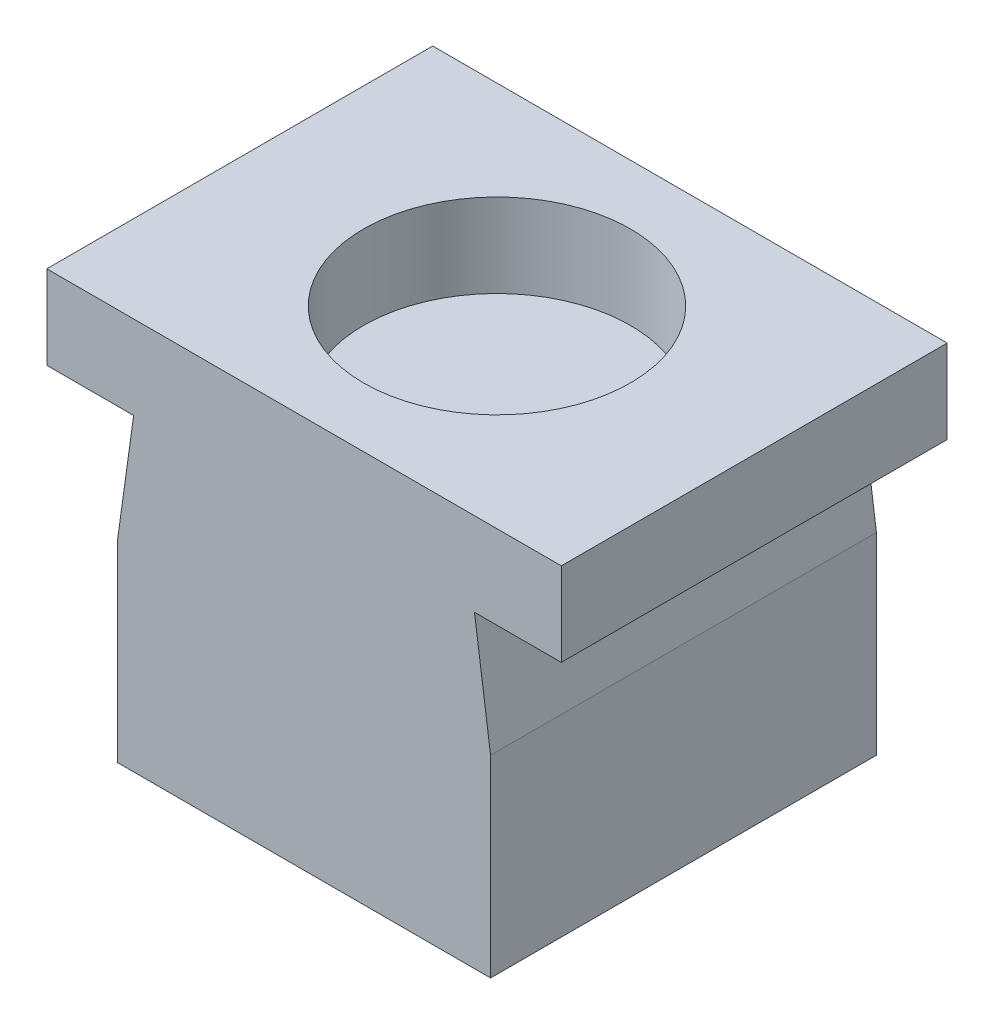
ISO-10303-21;
HEADER;
FILE_DESCRIPTION(('STEP AP214'),'2;1');
FILE_NAME('part.step','',(''),(''),'','','');
FILE_SCHEMA(('AUTOMOTIVE_DESIGN { 1 0 10303 214 1 1 1 1 }'));
ENDSEC;
DATA;
#1=APPLICATION_CONTEXT('core data for automotive mechanical design processes');
#2=APPLICATION_PROTOCOL_DEFINITION('international standard','automotive_design',2000,#1);
#3=PRODUCT_CONTEXT('',#1,'mechanical');
#4=PRODUCT('Part','Part','',(#3));
#5=PRODUCT_RELATED_PRODUCT_CATEGORY('part','',(#4));
#6=PRODUCT_DEFINITION_FORMATION('','',#4);
#7=PRODUCT_DEFINITION_CONTEXT('part definition',#1,'design');
#8=PRODUCT_DEFINITION('design','',#6,#7);
#9=PRODUCT_DEFINITION_SHAPE('','',#8);
#10=(LENGTH_UNIT() NAMED_UNIT(*) SI_UNIT(.MILLI.,.METRE.));
#11=(NAMED_UNIT(*) PLANE_ANGLE_UNIT() SI_UNIT($,.RADIAN.));
#12=(NAMED_UNIT(*) SI_UNIT($,.STERADIAN.) SOLID_ANGLE_UNIT());
#13=UNCERTAINTY_MEASURE_WITH_UNIT(LENGTH_MEASURE(1.E-05),#10,'distance_accuracy_value','');
#14=(GEOMETRIC_REPRESENTATION_CONTEXT(3) GLOBAL_UNCERTAINTY_ASSIGNED_CONTEXT((#13)) GLOBAL_UNIT_ASSIGNED_CONTEXT((#10,
#11,#12)) REPRESENTATION_CONTEXT('',''));
#15=CARTESIAN_POINT('',(0.,0.,0.));
#16=DIRECTION('',(0.,0.,1.));
#17=DIRECTION('',(1.,0.,0.));
#18=AXIS2_PLACEMENT_3D('',#15,#16,#17);
#19=CARTESIAN_POINT('',(20.,6.5,-15.));
#20=DIRECTION('',(0.,1.,0.));
#21=DIRECTION('',(0.,0.,1.));
#22=AXIS2_PLACEMENT_3D('',#19,#20,#21);
#23=PLANE('',#22);
#24=CARTESIAN_POINT('',(0.,6.5,0.));
#25=DIRECTION('',(0.,1.,0.));
#26=DIRECTION('',(0.,0.,1.));
#27=AXIS2_PLACEMENT_3D('',#24,#25,#26);
#28=CIRCLE('',#27,10.375);
#29=CARTESIAN_POINT('',(0.,6.5,10.375));
#30=VERTEX_POINT('',#29);
#31=EDGE_CURVE('E131',#30,#30,#28,.T.);
#32=ORIENTED_EDGE('',*,*,#31,.F.);
#33=EDGE_LOOP('',(#32));
#34=FACE_BOUND('',#33,.T.);
#35=DIRECTION('',(0.,0.,1.));
#36=VECTOR('',#35,1.);
#37=CARTESIAN_POINT('',(-20.,6.5,-15.));
#38=LINE('',#37,#36);
#39=CARTESIAN_POINT('',(-20.,6.5,-15.));
#40=VERTEX_POINT('',#39);
#41=CARTESIAN_POINT('',(-20.,6.5,15.));
#42=VERTEX_POINT('',#41);
#43=EDGE_CURVE('E36',#40,#42,#38,.T.);
#44=ORIENTED_EDGE('',*,*,#43,.T.);
#45=DIRECTION('',(-1.,0.,0.));
#46=VECTOR('',#45,1.);
#47=CARTESIAN_POINT('',(20.,6.5,15.));
#48=LINE('',#47,#46);
#49=CARTESIAN_POINT('',(20.,6.5,15.));
#50=VERTEX_POINT('',#49);
#51=EDGE_CURVE('E109',#50,#42,#48,.T.);
#52=ORIENTED_EDGE('',*,*,#51,.F.);
#53=DIRECTION('',(0.,0.,1.));
#54=VECTOR('',#53,1.);
#55=CARTESIAN_POINT('',(20.,6.5,-15.));
#56=LINE('',#55,#54);
#57=CARTESIAN_POINT('',(20.,6.5,-15.));
#58=VERTEX_POINT('',#57);
#59=EDGE_CURVE('E11',#58,#50,#56,.T.);
#60=ORIENTED_EDGE('',*,*,#59,.F.);
#61=DIRECTION('',(-1.,0.,0.));
#62=VECTOR('',#61,1.);
#63=CARTESIAN_POINT('',(20.,6.5,-15.));
#64=LINE('',#63,#62);
#65=EDGE_CURVE('E110',#58,#40,#64,.T.);
#66=ORIENTED_EDGE('',*,*,#65,.T.);
#67=EDGE_LOOP('',(#44,#52,#60,#66));
#68=FACE_BOUND('',#67,.T.);
#69=ADVANCED_FACE('F33',(#34,#68),#23,.T.);
#70=CARTESIAN_POINT('',(20.,6.5,-15.));
#71=DIRECTION('',(1.,0.,0.));
#72=DIRECTION('',(0.,0.,-1.));
#73=AXIS2_PLACEMENT_3D('',#70,#71,#72);
#74=PLANE('',#73);
#75=ORIENTED_EDGE('',*,*,#59,.T.);
#76=DIRECTION('',(0.,1.,0.));
#77=VECTOR('',#76,1.);
#78=CARTESIAN_POINT('',(20.,6.5,15.));
#79=LINE('',#78,#77);
#80=CARTESIAN_POINT('',(20.,0.,15.));
#81=VERTEX_POINT('',#80);
#82=EDGE_CURVE('E127',#81,#50,#79,.T.);
#83=ORIENTED_EDGE('',*,*,#82,.F.);
#84=DIRECTION('',(0.,0.,1.));
#85=VECTOR('',#84,1.);
#86=CARTESIAN_POINT('',(20.,0.,-15.));
#87=LINE('',#86,#85);
#88=CARTESIAN_POINT('',(20.,0.,-15.));
#89=VERTEX_POINT('',#88);
#90=EDGE_CURVE('E41',#89,#81,#87,.T.);
#91=ORIENTED_EDGE('',*,*,#90,.F.);
#92=DIRECTION('',(0.,1.,0.));
#93=VECTOR('',#92,1.);
#94=CARTESIAN_POINT('',(20.,6.5,-15.));
#95=LINE('',#94,#93);
#96=EDGE_CURVE('E115',#89,#58,#95,.T.);
#97=ORIENTED_EDGE('',*,*,#96,.T.);
#98=EDGE_LOOP('',(#75,#83,#91,#97));
#99=FACE_BOUND('',#98,.T.);
#100=ADVANCED_FACE('F220',(#99),#74,.T.);
#101=CARTESIAN_POINT('',(20.,0.,-15.));
#102=DIRECTION('',(0.,-1.,0.));
#103=DIRECTION('',(0.,0.,-1.));
#104=AXIS2_PLACEMENT_3D('',#101,#102,#103);
#105=PLANE('',#104);
#106=ORIENTED_EDGE('',*,*,#90,.T.);
#107=DIRECTION('',(1.,0.,0.));
#108=VECTOR('',#107,1.);
#109=CARTESIAN_POINT('',(20.,0.,15.));
#110=LINE('',#109,#108);
#111=CARTESIAN_POINT('',(13.25,0.,15.));
#112=VERTEX_POINT('',#111);
#113=EDGE_CURVE('E151',#112,#81,#110,.T.);
#114=ORIENTED_EDGE('',*,*,#113,.F.);
#115=DIRECTION('',(0.,0.,1.));
#116=VECTOR('',#115,1.);
#117=CARTESIAN_POINT('',(13.25,0.,-15.));
#118=LINE('',#117,#116);
#119=CARTESIAN_POINT('',(13.25,0.,-15.));
#120=VERTEX_POINT('',#119);
#121=EDGE_CURVE('E179',#120,#112,#118,.T.);
#122=ORIENTED_EDGE('',*,*,#121,.F.);
#123=DIRECTION('',(1.,0.,0.));
#124=VECTOR('',#123,1.);
#125=CARTESIAN_POINT('',(20.,0.,-15.));
#126=LINE('',#125,#124);
#127=EDGE_CURVE('E175',#120,#89,#126,.T.);
#128=ORIENTED_EDGE('',*,*,#127,.T.);
#129=EDGE_LOOP('',(#106,#114,#122,#128));
#130=FACE_BOUND('',#129,.T.);
#131=ADVANCED_FACE('F218',(#130),#105,.T.);
#132=CARTESIAN_POINT('',(13.25,0.,-15.));
#133=DIRECTION('',(0.990492273177751,0.137568371274688,0.));
#134=DIRECTION('',(-0.137568371274688,0.990492273177752,0.));
#135=AXIS2_PLACEMENT_3D('',#132,#133,#134);
#136=PLANE('',#135);
#137=ORIENTED_EDGE('',*,*,#121,.T.);
#138=DIRECTION('',(-0.137568371274688,0.990492273177752,0.));
#139=VECTOR('',#138,1.);
#140=CARTESIAN_POINT('',(13.25,0.,15.));
#141=LINE('',#140,#139);
#142=CARTESIAN_POINT('',(14.5,-9.,15.));
#143=VERTEX_POINT('',#142);
#144=EDGE_CURVE('E148',#143,#112,#141,.T.);
#145=ORIENTED_EDGE('',*,*,#144,.F.);
#146=DIRECTION('',(0.,0.,1.));
#147=VECTOR('',#146,1.);
#148=CARTESIAN_POINT('',(14.5,-9.,-15.));
#149=LINE('',#148,#147);
#150=CARTESIAN_POINT('',(14.5,-9.,-15.));
#151=VERTEX_POINT('',#150);
#152=EDGE_CURVE('E181',#151,#143,#149,.T.);
#153=ORIENTED_EDGE('',*,*,#152,.F.);
#154=DIRECTION('',(-0.137568371274688,0.990492273177752,0.));
#155=VECTOR('',#154,1.);
#156=CARTESIAN_POINT('',(13.25,0.,-15.));
#157=LINE('',#156,#155);
#158=EDGE_CURVE('E172',#151,#120,#157,.T.);
#159=ORIENTED_EDGE('',*,*,#158,.T.);
#160=EDGE_LOOP('',(#137,#145,#153,#159));
#161=FACE_BOUND('',#160,.T.);
#162=ADVANCED_FACE('F214',(#161),#136,.T.);
#163=CARTESIAN_POINT('',(14.5,-9.,-15.));
#164=DIRECTION('',(1.,0.,0.));
#165=DIRECTION('',(0.,1.,0.));
#166=AXIS2_PLACEMENT_3D('',#163,#164,#165);
#167=PLANE('',#166);
#168=ORIENTED_EDGE('',*,*,#152,.T.);
#169=DIRECTION('',(0.,1.,0.));
#170=VECTOR('',#169,1.);
#171=CARTESIAN_POINT('',(14.5,-9.,15.));
#172=LINE('',#171,#170);
#173=CARTESIAN_POINT('',(14.5,-24.,15.));
#174=VERTEX_POINT('',#173);
#175=EDGE_CURVE('E145',#174,#143,#172,.T.);
#176=ORIENTED_EDGE('',*,*,#175,.F.);
#177=DIRECTION('',(0.,0.,1.));
#178=VECTOR('',#177,1.);
#179=CARTESIAN_POINT('',(14.5,-24.,-15.));
#180=LINE('',#179,#178);
#181=CARTESIAN_POINT('',(14.5,-24.,-15.));
#182=VERTEX_POINT('',#181);
#183=EDGE_CURVE('E183',#182,#174,#180,.T.);
#184=ORIENTED_EDGE('',*,*,#183,.F.);
#185=DIRECTION('',(0.,1.,0.));
#186=VECTOR('',#185,1.);
#187=CARTESIAN_POINT('',(14.5,-9.,-15.));
#188=LINE('',#187,#186);
#189=EDGE_CURVE('E169',#182,#151,#188,.T.);
#190=ORIENTED_EDGE('',*,*,#189,.T.);
#191=EDGE_LOOP('',(#168,#176,#184,#190));
#192=FACE_BOUND('',#191,.T.);
#193=ADVANCED_FACE('F212',(#192),#167,.T.);
#194=CARTESIAN_POINT('',(-14.5,-24.,-15.));
#195=DIRECTION('',(0.,-1.,0.));
#196=DIRECTION('',(0.,0.,-1.));
#197=AXIS2_PLACEMENT_3D('',#194,#195,#196);
#198=PLANE('',#197);
#199=ORIENTED_EDGE('',*,*,#183,.T.);
#200=DIRECTION('',(1.,0.,0.));
#201=VECTOR('',#200,1.);
#202=CARTESIAN_POINT('',(-14.5,-24.,15.));
#203=LINE('',#202,#201);
#204=CARTESIAN_POINT('',(-14.5,-24.,15.));
#205=VERTEX_POINT('',#204);
#206=EDGE_CURVE('E142',#205,#174,#203,.T.);
#207=ORIENTED_EDGE('',*,*,#206,.F.);
#208=DIRECTION('',(0.,0.,1.));
#209=VECTOR('',#208,1.);
#210=CARTESIAN_POINT('',(-14.5,-24.,-15.));
#211=LINE('',#210,#209);
#212=CARTESIAN_POINT('',(-14.5,-24.,-15.));
#213=VERTEX_POINT('',#212);
#214=EDGE_CURVE('E185',#213,#205,#211,.T.);
#215=ORIENTED_EDGE('',*,*,#214,.F.);
#216=DIRECTION('',(1.,0.,0.));
#217=VECTOR('',#216,1.);
#218=CARTESIAN_POINT('',(-14.5,-24.,-15.));
#219=LINE('',#218,#217);
#220=EDGE_CURVE('E166',#213,#182,#219,.T.);
#221=ORIENTED_EDGE('',*,*,#220,.T.);
#222=EDGE_LOOP('',(#199,#207,#215,#221));
#223=FACE_BOUND('',#222,.T.);
#224=ADVANCED_FACE('F207',(#223),#198,.T.);
#225=CARTESIAN_POINT('',(-14.5,-9.,-15.));
#226=DIRECTION('',(-1.,0.,0.));
#227=DIRECTION('',(0.,-1.,0.));
#228=AXIS2_PLACEMENT_3D('',#225,#226,#227);
#229=PLANE('',#228);
#230=ORIENTED_EDGE('',*,*,#214,.T.);
#231=DIRECTION('',(0.,-1.,0.));
#232=VECTOR('',#231,1.);
#233=CARTESIAN_POINT('',(-14.5,-9.,15.));
#234=LINE('',#233,#232);
#235=CARTESIAN_POINT('',(-14.5,-9.,15.));
#236=VERTEX_POINT('',#235);
#237=EDGE_CURVE('E139',#236,#205,#234,.T.);
#238=ORIENTED_EDGE('',*,*,#237,.F.);
#239=DIRECTION('',(0.,0.,1.));
#240=VECTOR('',#239,1.);
#241=CARTESIAN_POINT('',(-14.5,-9.,-15.));
#242=LINE('',#241,#240);
#243=CARTESIAN_POINT('',(-14.5,-9.,-15.));
#244=VERTEX_POINT('',#243);
#245=EDGE_CURVE('E187',#244,#236,#242,.T.);
#246=ORIENTED_EDGE('',*,*,#245,.F.);
#247=DIRECTION('',(0.,-1.,0.));
#248=VECTOR('',#247,1.);
#249=CARTESIAN_POINT('',(-14.5,-9.,-15.));
#250=LINE('',#249,#248);
#251=EDGE_CURVE('E163',#244,#213,#250,.T.);
#252=ORIENTED_EDGE('',*,*,#251,.T.);
#253=EDGE_LOOP('',(#230,#238,#246,#252));
#254=FACE_BOUND('',#253,.T.);
#255=ADVANCED_FACE('F200',(#254),#229,.T.);
#256=CARTESIAN_POINT('',(-13.25,0.,-15.));
#257=DIRECTION('',(-0.990492273177751,0.137568371274688,0.));
#258=DIRECTION('',(-0.137568371274688,-0.990492273177752,0.));
#259=AXIS2_PLACEMENT_3D('',#256,#257,#258);
#260=PLANE('',#259);
#261=ORIENTED_EDGE('',*,*,#245,.T.);
#262=DIRECTION('',(-0.137568371274688,-0.990492273177752,0.));
#263=VECTOR('',#262,1.);
#264=CARTESIAN_POINT('',(-13.25,0.,15.));
#265=LINE('',#264,#263);
#266=CARTESIAN_POINT('',(-13.25,0.,15.));
#267=VERTEX_POINT('',#266);
#268=EDGE_CURVE('E136',#267,#236,#265,.T.);
#269=ORIENTED_EDGE('',*,*,#268,.F.);
#270=DIRECTION('',(0.,0.,1.));
#271=VECTOR('',#270,1.);
#272=CARTESIAN_POINT('',(-13.25,0.,-15.));
#273=LINE('',#272,#271);
#274=CARTESIAN_POINT('',(-13.25,0.,-15.));
#275=VERTEX_POINT('',#274);
#276=EDGE_CURVE('E189',#275,#267,#273,.T.);
#277=ORIENTED_EDGE('',*,*,#276,.F.);
#278=DIRECTION('',(-0.137568371274688,-0.990492273177752,0.));
#279=VECTOR('',#278,1.);
#280=CARTESIAN_POINT('',(-13.25,0.,-15.));
#281=LINE('',#280,#279);
#282=EDGE_CURVE('E160',#275,#244,#281,.T.);
#283=ORIENTED_EDGE('',*,*,#282,.T.);
#284=EDGE_LOOP('',(#261,#269,#277,#283));
#285=FACE_BOUND('',#284,.T.);
#286=ADVANCED_FACE('F197',(#285),#260,.T.);
#287=CARTESIAN_POINT('',(-20.,0.,-15.));
#288=DIRECTION('',(0.,-1.,0.));
#289=DIRECTION('',(0.,0.,-1.));
#290=AXIS2_PLACEMENT_3D('',#287,#288,#289);
#291=PLANE('',#290);
#292=ORIENTED_EDGE('',*,*,#276,.T.);
#293=DIRECTION('',(1.,0.,0.));
#294=VECTOR('',#293,1.);
#295=CARTESIAN_POINT('',(-20.,0.,15.));
#296=LINE('',#295,#294);
#297=CARTESIAN_POINT('',(-20.,0.,15.));
#298=VERTEX_POINT('',#297);
#299=EDGE_CURVE('E122',#298,#267,#296,.T.);
#300=ORIENTED_EDGE('',*,*,#299,.F.);
#301=DIRECTION('',(0.,0.,1.));
#302=VECTOR('',#301,1.);
#303=CARTESIAN_POINT('',(-20.,0.,-15.));
#304=LINE('',#303,#302);
#305=CARTESIAN_POINT('',(-20.,0.,-15.));
#306=VERTEX_POINT('',#305);
#307=EDGE_CURVE('E114',#306,#298,#304,.T.);
#308=ORIENTED_EDGE('',*,*,#307,.F.);
#309=DIRECTION('',(1.,0.,0.));
#310=VECTOR('',#309,1.);
#311=CARTESIAN_POINT('',(-20.,0.,-15.));
#312=LINE('',#311,#310);
#313=EDGE_CURVE('E157',#306,#275,#312,.T.);
#314=ORIENTED_EDGE('',*,*,#313,.T.);
#315=EDGE_LOOP('',(#292,#300,#308,#314));
#316=FACE_BOUND('',#315,.T.);
#317=ADVANCED_FACE('F191',(#316),#291,.T.);
#318=CARTESIAN_POINT('',(-20.,6.5,-15.));
#319=DIRECTION('',(-1.,0.,0.));
#320=DIRECTION('',(0.,0.,1.));
#321=AXIS2_PLACEMENT_3D('',#318,#319,#320);
#322=PLANE('',#321);
#323=ORIENTED_EDGE('',*,*,#307,.T.);
#324=DIRECTION('',(0.,-1.,0.));
#325=VECTOR('',#324,1.);
#326=CARTESIAN_POINT('',(-20.,6.5,15.));
#327=LINE('',#326,#325);
#328=EDGE_CURVE('E117',#42,#298,#327,.T.);
#329=ORIENTED_EDGE('',*,*,#328,.F.);
#330=ORIENTED_EDGE('',*,*,#43,.F.);
#331=DIRECTION('',(0.,-1.,0.));
#332=VECTOR('',#331,1.);
#333=CARTESIAN_POINT('',(-20.,6.5,-15.));
#334=LINE('',#333,#332);
#335=EDGE_CURVE('E155',#40,#306,#334,.T.);
#336=ORIENTED_EDGE('',*,*,#335,.T.);
#337=EDGE_LOOP('',(#323,#329,#330,#336));
#338=FACE_BOUND('',#337,.T.);
#339=ADVANCED_FACE('F118',(#338),#322,.T.);
#340=CARTESIAN_POINT('',(0.,0.,-15.));
#341=DIRECTION('',(0.,0.,1.));
#342=DIRECTION('',(1.,0.,0.));
#343=AXIS2_PLACEMENT_3D('',#340,#341,#342);
#344=PLANE('',#343);
#345=ORIENTED_EDGE('',*,*,#65,.F.);
#346=ORIENTED_EDGE('',*,*,#96,.F.);
#347=ORIENTED_EDGE('',*,*,#127,.F.);
#348=ORIENTED_EDGE('',*,*,#158,.F.);
#349=ORIENTED_EDGE('',*,*,#189,.F.);
#350=ORIENTED_EDGE('',*,*,#220,.F.);
#351=ORIENTED_EDGE('',*,*,#251,.F.);
#352=ORIENTED_EDGE('',*,*,#282,.F.);
#353=ORIENTED_EDGE('',*,*,#313,.F.);
#354=ORIENTED_EDGE('',*,*,#335,.F.);
#355=EDGE_LOOP('',(#345,#346,#347,#348,#349,#350,#351,#352,#353,#354));
#356=FACE_BOUND('',#355,.T.);
#357=ADVANCED_FACE('F203',(#356),#344,.F.);
#358=CARTESIAN_POINT('',(0.,0.,15.));
#359=DIRECTION('',(0.,0.,1.));
#360=DIRECTION('',(1.,0.,0.));
#361=AXIS2_PLACEMENT_3D('',#358,#359,#360);
#362=PLANE('',#361);
#363=ORIENTED_EDGE('',*,*,#51,.T.);
#364=ORIENTED_EDGE('',*,*,#328,.T.);
#365=ORIENTED_EDGE('',*,*,#299,.T.);
#366=ORIENTED_EDGE('',*,*,#268,.T.);
#367=ORIENTED_EDGE('',*,*,#237,.T.);
#368=ORIENTED_EDGE('',*,*,#206,.T.);
#369=ORIENTED_EDGE('',*,*,#175,.T.);
#370=ORIENTED_EDGE('',*,*,#144,.T.);
#371=ORIENTED_EDGE('',*,*,#113,.T.);
#372=ORIENTED_EDGE('',*,*,#82,.T.);
#373=EDGE_LOOP('',(#363,#364,#365,#366,#367,#368,#369,#370,#371,#372));
#374=FACE_BOUND('',#373,.T.);
#375=ADVANCED_FACE('F125',(#374),#362,.T.);
#376=CARTESIAN_POINT('',(0.,0.,0.));
#377=DIRECTION('',(0.,1.,0.));
#378=DIRECTION('',(0.,0.,1.));
#379=AXIS2_PLACEMENT_3D('',#376,#377,#378);
#380=CYLINDRICAL_SURFACE('',#379,10.375);
#381=CARTESIAN_POINT('',(0.,0.,0.));
#382=DIRECTION('',(0.,1.,0.));
#383=DIRECTION('',(0.,0.,1.));
#384=AXIS2_PLACEMENT_3D('',#381,#382,#383);
#385=CIRCLE('',#384,10.375);
#386=CARTESIAN_POINT('',(0.,0.,10.375));
#387=VERTEX_POINT('',#386);
#388=EDGE_CURVE('E128',#387,#387,#385,.T.);
#389=CARTESIAN_POINT('',(0.,0.,10.375));
#390=CARTESIAN_POINT('',(0.,0.0677083333333332,10.375));
#391=CARTESIAN_POINT('',(0.,0.135416666666667,10.375));
#392=CARTESIAN_POINT('',(0.,0.270833333333333,10.375));
#393=CARTESIAN_POINT('',(0.,0.338541666666667,10.375));
#394=CARTESIAN_POINT('',(0.,0.473958333333333,10.375));
#395=CARTESIAN_POINT('',(0.,0.541666666666667,10.375));
#396=CARTESIAN_POINT('',(0.,0.677083333333333,10.375));
#397=CARTESIAN_POINT('',(0.,0.744791666666667,10.375));
#398=CARTESIAN_POINT('',(0.,0.880208333333333,10.375));
#399=CARTESIAN_POINT('',(0.,0.947916666666667,10.375));
#400=CARTESIAN_POINT('',(0.,1.08333333333333,10.375));
#401=CARTESIAN_POINT('',(0.,1.15104166666667,10.375));
#402=CARTESIAN_POINT('',(0.,1.28645833333333,10.375));
#403=CARTESIAN_POINT('',(0.,1.35416666666667,10.375));
#404=CARTESIAN_POINT('',(0.,1.48958333333333,10.375));
#405=CARTESIAN_POINT('',(0.,1.55729166666667,10.375));
#406=CARTESIAN_POINT('',(0.,1.69270833333333,10.375));
#407=CARTESIAN_POINT('',(0.,1.76041666666667,10.375));
#408=CARTESIAN_POINT('',(0.,1.89583333333333,10.375));
#409=CARTESIAN_POINT('',(0.,1.96354166666667,10.375));
#410=CARTESIAN_POINT('',(0.,2.09895833333333,10.375));
#411=CARTESIAN_POINT('',(0.,2.16666666666667,10.375));
#412=CARTESIAN_POINT('',(0.,2.30208333333333,10.375));
#413=CARTESIAN_POINT('',(0.,2.36979166666667,10.375));
#414=CARTESIAN_POINT('',(0.,2.50520833333333,10.375));
#415=CARTESIAN_POINT('',(0.,2.57291666666667,10.375));
#416=CARTESIAN_POINT('',(0.,2.70833333333333,10.375));
#417=CARTESIAN_POINT('',(0.,2.77604166666667,10.375));
#418=CARTESIAN_POINT('',(0.,2.91145833333333,10.375));
#419=CARTESIAN_POINT('',(0.,2.97916666666667,10.375));
#420=CARTESIAN_POINT('',(0.,3.11458333333333,10.375));
#421=CARTESIAN_POINT('',(0.,3.18229166666667,10.375));
#422=CARTESIAN_POINT('',(0.,3.31770833333333,10.375));
#423=CARTESIAN_POINT('',(0.,3.38541666666667,10.375));
#424=CARTESIAN_POINT('',(0.,3.52083333333333,10.375));
#425=CARTESIAN_POINT('',(0.,3.58854166666667,10.375));
#426=CARTESIAN_POINT('',(0.,3.72395833333333,10.375));
#427=CARTESIAN_POINT('',(0.,3.79166666666667,10.375));
#428=CARTESIAN_POINT('',(0.,3.92708333333333,10.375));
#429=CARTESIAN_POINT('',(0.,3.99479166666667,10.375));
#430=CARTESIAN_POINT('',(0.,4.13020833333333,10.375));
#431=CARTESIAN_POINT('',(0.,4.19791666666667,10.375));
#432=CARTESIAN_POINT('',(0.,4.33333333333333,10.375));
#433=CARTESIAN_POINT('',(0.,4.40104166666667,10.375));
#434=CARTESIAN_POINT('',(0.,4.53645833333333,10.375));
#435=CARTESIAN_POINT('',(0.,4.60416666666667,10.375));
#436=CARTESIAN_POINT('',(0.,4.73958333333333,10.375));
#437=CARTESIAN_POINT('',(0.,4.80729166666667,10.375));
#438=CARTESIAN_POINT('',(0.,4.94270833333333,10.375));
#439=CARTESIAN_POINT('',(0.,5.01041666666667,10.375));
#440=CARTESIAN_POINT('',(0.,5.14583333333333,10.375));
#441=CARTESIAN_POINT('',(0.,5.21354166666667,10.375));
#442=CARTESIAN_POINT('',(0.,5.34895833333333,10.375));
#443=CARTESIAN_POINT('',(0.,5.41666666666667,10.375));
#444=CARTESIAN_POINT('',(0.,5.55208333333333,10.375));
#445=CARTESIAN_POINT('',(0.,5.61979166666667,10.375));
#446=CARTESIAN_POINT('',(0.,5.75520833333333,10.375));
#447=CARTESIAN_POINT('',(0.,5.82291666666667,10.375));
#448=CARTESIAN_POINT('',(0.,5.95833333333333,10.375));
#449=CARTESIAN_POINT('',(0.,6.02604166666667,10.375));
#450=CARTESIAN_POINT('',(0.,6.16145833333333,10.375));
#451=CARTESIAN_POINT('',(0.,6.22916666666667,10.375));
#452=CARTESIAN_POINT('',(0.,6.36458333333333,10.375));
#453=CARTESIAN_POINT('',(0.,6.43229166666667,10.375));
#454=CARTESIAN_POINT('',(0.,6.5,10.375));
#455=B_SPLINE_CURVE_WITH_KNOTS('',3,(#389,#390,#391,#392,#393,#394,#395,#396,#397,#398,#399,
#400,#401,#402,#403,#404,#405,#406,#407,#408,#409,#410,#411,#412,#413,#414,#415,#416,#417,#418,
#419,#420,#421,#422,#423,#424,#425,#426,#427,#428,#429,#430,#431,#432,#433,#434,#435,#436,#437,
#438,#439,#440,#441,#442,#443,#444,#445,#446,#447,#448,#449,#450,#451,#452,#453,#454),
.UNSPECIFIED.,.F.,.F.,(4,2,2,2,2,2,2,2,2,2,2,2,2,2,2,2,2,2,2,2,2,2,2,2,2,2,2,2,2,2,2,2,4),(0.,
0.203125,0.40625,0.609375,0.8125,1.015625,1.21875,1.421875,1.625,1.828125,2.03125,2.234375,
2.4375,2.640625,2.84375,3.046875,3.25,3.453125,3.65625,3.859375,4.0625,4.265625,4.46875,
4.671875,4.875,5.078125,5.28125,5.484375,5.6875,5.890625,6.09375,6.296875,6.5),.UNSPECIFIED.);
#456=EDGE_CURVE('BSEAM250',#387,#30,#455,.T.);
#457=ORIENTED_EDGE('',*,*,#388,.F.);
#458=ORIENTED_EDGE('',*,*,#31,.T.);
#459=ORIENTED_EDGE('',*,*,#456,.T.);
#460=ORIENTED_EDGE('',*,*,#456,.F.);
#461=EDGE_LOOP('',(#457,#459,#458,#460));
#462=FACE_BOUND('',#461,.T.);
#463=ADVANCED_FACE('F250',(#462),#380,.F.);
#464=CARTESIAN_POINT('',(0.,0.,0.));
#465=DIRECTION('',(0.,1.,0.));
#466=DIRECTION('',(0.,0.,1.));
#467=AXIS2_PLACEMENT_3D('',#464,#465,#466);
#468=PLANE('',#467);
#469=ORIENTED_EDGE('',*,*,#388,.T.);
#470=EDGE_LOOP('',(#469));
#471=FACE_BOUND('',#470,.T.);
#472=ADVANCED_FACE('F254',(#471),#468,.T.);
#473=CLOSED_SHELL('',(#69,#100,#131,#162,#193,#224,#255,#286,#317,#339,#357,#375,#463,#472));
#474=MANIFOLD_SOLID_BREP('B2',#473);
#475=ADVANCED_BREP_SHAPE_REPRESENTATION('',(#18,#474),#14);
#476=SHAPE_DEFINITION_REPRESENTATION(#9,#475);
ENDSEC;
END-ISO-10303-21;
